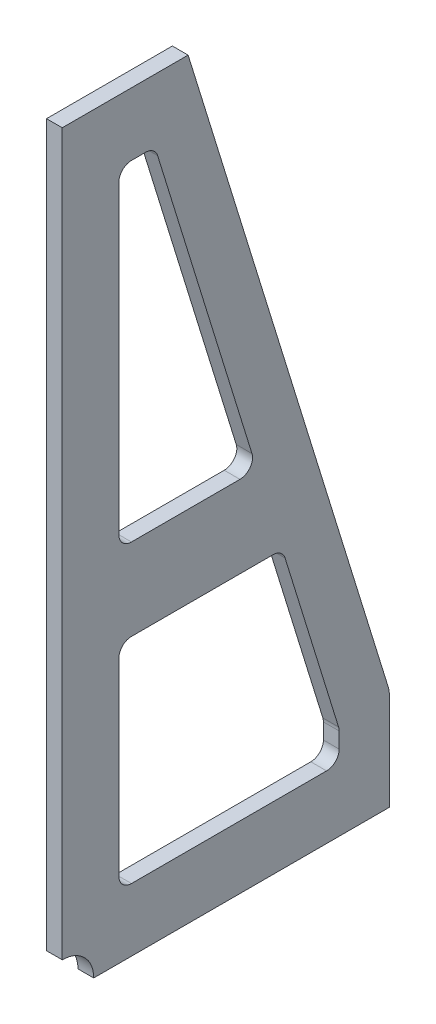
ISO-10303-21;
HEADER;
FILE_DESCRIPTION(('STEP AP214'),'2;1');
FILE_NAME('part.step','',(''),(''),'','','');
FILE_SCHEMA(('AUTOMOTIVE_DESIGN { 1 0 10303 214 1 1 1 1 }'));
ENDSEC;
DATA;
#1=APPLICATION_CONTEXT('core data for automotive mechanical design processes');
#2=APPLICATION_PROTOCOL_DEFINITION('international standard','automotive_design',2000,#1);
#3=PRODUCT_CONTEXT('',#1,'mechanical');
#4=PRODUCT('Part','Part','',(#3));
#5=PRODUCT_RELATED_PRODUCT_CATEGORY('part','',(#4));
#6=PRODUCT_DEFINITION_FORMATION('','',#4);
#7=PRODUCT_DEFINITION_CONTEXT('part definition',#1,'design');
#8=PRODUCT_DEFINITION('design','',#6,#7);
#9=PRODUCT_DEFINITION_SHAPE('','',#8);
#10=(LENGTH_UNIT() NAMED_UNIT(*) SI_UNIT(.MILLI.,.METRE.));
#11=(NAMED_UNIT(*) PLANE_ANGLE_UNIT() SI_UNIT($,.RADIAN.));
#12=(NAMED_UNIT(*) SI_UNIT($,.STERADIAN.) SOLID_ANGLE_UNIT());
#13=UNCERTAINTY_MEASURE_WITH_UNIT(LENGTH_MEASURE(1.E-05),#10,'distance_accuracy_value','');
#14=(GEOMETRIC_REPRESENTATION_CONTEXT(3) GLOBAL_UNCERTAINTY_ASSIGNED_CONTEXT((#13)) GLOBAL_UNIT_ASSIGNED_CONTEXT((#10,
#11,#12)) REPRESENTATION_CONTEXT('',''));
#15=CARTESIAN_POINT('',(0.,0.,0.));
#16=DIRECTION('',(0.,0.,1.));
#17=DIRECTION('',(1.,0.,0.));
#18=AXIS2_PLACEMENT_3D('',#15,#16,#17);
#19=CARTESIAN_POINT('',(-25.,0.,0.));
#20=DIRECTION('',(1.,0.,0.));
#21=DIRECTION('',(0.,0.,-1.));
#22=AXIS2_PLACEMENT_3D('',#19,#20,#21);
#23=CYLINDRICAL_SURFACE('',#22,50.);
#24=CARTESIAN_POINT('',(0.,0.,0.));
#25=DIRECTION('',(-1.,0.,0.));
#26=DIRECTION('',(0.,0.,-1.));
#27=AXIS2_PLACEMENT_3D('',#24,#25,#26);
#28=CIRCLE('',#27,50.);
#29=CARTESIAN_POINT('',(0.,50.,0.));
#30=VERTEX_POINT('',#29);
#31=CARTESIAN_POINT('',(0.,0.,-50.));
#32=VERTEX_POINT('',#31);
#33=EDGE_CURVE('E254',#30,#32,#28,.T.);
#34=ORIENTED_EDGE('',*,*,#33,.F.);
#35=DIRECTION('',(1.,0.,0.));
#36=VECTOR('',#35,1.);
#37=CARTESIAN_POINT('',(-25.,50.,0.));
#38=LINE('',#37,#36);
#39=CARTESIAN_POINT('',(-25.,50.,0.));
#40=VERTEX_POINT('',#39);
#41=EDGE_CURVE('E11',#40,#30,#38,.T.);
#42=ORIENTED_EDGE('',*,*,#41,.F.);
#43=CARTESIAN_POINT('',(-25.,0.,0.));
#44=DIRECTION('',(-1.,0.,0.));
#45=DIRECTION('',(0.,0.,-1.));
#46=AXIS2_PLACEMENT_3D('',#43,#44,#45);
#47=CIRCLE('',#46,50.);
#48=CARTESIAN_POINT('',(-25.,0.,-50.));
#49=VERTEX_POINT('',#48);
#50=EDGE_CURVE('E392',#40,#49,#47,.T.);
#51=ORIENTED_EDGE('',*,*,#50,.T.);
#52=DIRECTION('',(1.,0.,0.));
#53=VECTOR('',#52,1.);
#54=CARTESIAN_POINT('',(-25.,0.,-50.));
#55=LINE('',#54,#53);
#56=EDGE_CURVE('E45',#49,#32,#55,.T.);
#57=ORIENTED_EDGE('',*,*,#56,.T.);
#58=EDGE_LOOP('',(#34,#42,#51,#57));
#59=FACE_BOUND('',#58,.T.);
#60=ADVANCED_FACE('F42',(#59),#23,.F.);
#61=CARTESIAN_POINT('',(-25.,50.,0.));
#62=DIRECTION('',(0.,0.,1.));
#63=DIRECTION('',(1.,0.,0.));
#64=AXIS2_PLACEMENT_3D('',#61,#62,#63);
#65=PLANE('',#64);
#66=DIRECTION('',(0.,-1.,0.));
#67=VECTOR('',#66,1.);
#68=CARTESIAN_POINT('',(0.,50.,0.));
#69=LINE('',#68,#67);
#70=CARTESIAN_POINT('',(0.,1195.,0.));
#71=VERTEX_POINT('',#70);
#72=EDGE_CURVE('E397',#71,#30,#69,.T.);
#73=ORIENTED_EDGE('',*,*,#72,.F.);
#74=DIRECTION('',(1.,0.,0.));
#75=VECTOR('',#74,1.);
#76=CARTESIAN_POINT('',(-25.,1195.,0.));
#77=LINE('',#76,#75);
#78=CARTESIAN_POINT('',(-25.,1195.,0.));
#79=VERTEX_POINT('',#78);
#80=EDGE_CURVE('E51',#79,#71,#77,.T.);
#81=ORIENTED_EDGE('',*,*,#80,.F.);
#82=DIRECTION('',(0.,-1.,0.));
#83=VECTOR('',#82,1.);
#84=CARTESIAN_POINT('',(-25.,50.,0.));
#85=LINE('',#84,#83);
#86=EDGE_CURVE('E415',#79,#40,#85,.T.);
#87=ORIENTED_EDGE('',*,*,#86,.T.);
#88=ORIENTED_EDGE('',*,*,#41,.T.);
#89=EDGE_LOOP('',(#73,#81,#87,#88));
#90=FACE_BOUND('',#89,.T.);
#91=ADVANCED_FACE('F469',(#90),#65,.T.);
#92=CARTESIAN_POINT('',(-25.,1195.,0.));
#93=DIRECTION('',(0.,1.,0.));
#94=DIRECTION('',(0.,0.,1.));
#95=AXIS2_PLACEMENT_3D('',#92,#93,#94);
#96=PLANE('',#95);
#97=DIRECTION('',(0.,0.,1.));
#98=VECTOR('',#97,1.);
#99=CARTESIAN_POINT('',(0.,1195.,0.));
#100=LINE('',#99,#98);
#101=CARTESIAN_POINT('',(0.,1195.,-200.));
#102=VERTEX_POINT('',#101);
#103=EDGE_CURVE('E438',#102,#71,#100,.T.);
#104=ORIENTED_EDGE('',*,*,#103,.F.);
#105=DIRECTION('',(1.,0.,0.));
#106=VECTOR('',#105,1.);
#107=CARTESIAN_POINT('',(-25.,1195.,-200.));
#108=LINE('',#107,#106);
#109=CARTESIAN_POINT('',(-25.,1195.,-200.));
#110=VERTEX_POINT('',#109);
#111=EDGE_CURVE('E445',#110,#102,#108,.T.);
#112=ORIENTED_EDGE('',*,*,#111,.F.);
#113=DIRECTION('',(0.,0.,1.));
#114=VECTOR('',#113,1.);
#115=CARTESIAN_POINT('',(-25.,1195.,0.));
#116=LINE('',#115,#114);
#117=EDGE_CURVE('E412',#110,#79,#116,.T.);
#118=ORIENTED_EDGE('',*,*,#117,.T.);
#119=ORIENTED_EDGE('',*,*,#80,.T.);
#120=EDGE_LOOP('',(#104,#112,#118,#119));
#121=FACE_BOUND('',#120,.T.);
#122=ADVANCED_FACE('F485',(#121),#96,.T.);
#123=CARTESIAN_POINT('',(-25.,1195.,-200.));
#124=DIRECTION('',(0.,0.295382867562168,-0.955378962271386));
#125=DIRECTION('',(0.,0.955378962271386,0.295382867562168));
#126=AXIS2_PLACEMENT_3D('',#123,#124,#125);
#127=PLANE('',#126);
#128=DIRECTION('',(0.,0.955378962271386,0.295382867562168));
#129=VECTOR('',#128,1.);
#130=CARTESIAN_POINT('',(0.,1195.,-200.));
#131=LINE('',#130,#129);
#132=CARTESIAN_POINT('',(0.,167.216058445174,-517.768948113569));
#133=VERTEX_POINT('',#132);
#134=EDGE_CURVE('E434',#133,#102,#131,.T.);
#135=ORIENTED_EDGE('',*,*,#134,.F.);
#136=DIRECTION('',(1.,0.,0.));
#137=VECTOR('',#136,1.);
#138=CARTESIAN_POINT('',(-25.,167.216058445174,-517.768948113569));
#139=LINE('',#138,#137);
#140=CARTESIAN_POINT('',(-25.,167.216058445174,-517.768948113569));
#141=VERTEX_POINT('',#140);
#142=EDGE_CURVE('E447',#141,#133,#139,.T.);
#143=ORIENTED_EDGE('',*,*,#142,.F.);
#144=DIRECTION('',(0.,0.955378962271386,0.295382867562168));
#145=VECTOR('',#144,1.);
#146=CARTESIAN_POINT('',(-25.,1195.,-200.));
#147=LINE('',#146,#145);
#148=EDGE_CURVE('E408',#141,#110,#147,.T.);
#149=ORIENTED_EDGE('',*,*,#148,.T.);
#150=ORIENTED_EDGE('',*,*,#111,.T.);
#151=EDGE_LOOP('',(#135,#143,#149,#150));
#152=FACE_BOUND('',#151,.T.);
#153=ADVANCED_FACE('F483',(#152),#127,.T.);
#154=CARTESIAN_POINT('',(-25.,152.446915067066,-470.));
#155=DIRECTION('',(1.,0.,0.));
#156=DIRECTION('',(0.,0.,-1.));
#157=AXIS2_PLACEMENT_3D('',#154,#155,#156);
#158=CYLINDRICAL_SURFACE('',#157,50.);
#159=CARTESIAN_POINT('',(0.,152.446915067066,-470.));
#160=DIRECTION('',(1.,0.,0.));
#161=DIRECTION('',(0.,0.,1.));
#162=AXIS2_PLACEMENT_3D('',#159,#160,#161);
#163=CIRCLE('',#162,50.);
#164=CARTESIAN_POINT('',(0.,152.446915067066,-520.));
#165=VERTEX_POINT('',#164);
#166=EDGE_CURVE('E430',#165,#133,#163,.T.);
#167=ORIENTED_EDGE('',*,*,#166,.F.);
#168=DIRECTION('',(1.,0.,0.));
#169=VECTOR('',#168,1.);
#170=CARTESIAN_POINT('',(-25.,152.446915067066,-520.));
#171=LINE('',#170,#169);
#172=CARTESIAN_POINT('',(-25.,152.446915067066,-520.));
#173=VERTEX_POINT('',#172);
#174=EDGE_CURVE('E450',#173,#165,#171,.T.);
#175=ORIENTED_EDGE('',*,*,#174,.F.);
#176=CARTESIAN_POINT('',(-25.,152.446915067066,-470.));
#177=DIRECTION('',(1.,0.,0.));
#178=DIRECTION('',(0.,0.,1.));
#179=AXIS2_PLACEMENT_3D('',#176,#177,#178);
#180=CIRCLE('',#179,50.);
#181=EDGE_CURVE('E405',#173,#141,#180,.T.);
#182=ORIENTED_EDGE('',*,*,#181,.T.);
#183=ORIENTED_EDGE('',*,*,#142,.T.);
#184=EDGE_LOOP('',(#167,#175,#182,#183));
#185=FACE_BOUND('',#184,.T.);
#186=ADVANCED_FACE('F481',(#185),#158,.T.);
#187=CARTESIAN_POINT('',(-25.,152.446915067066,-520.));
#188=DIRECTION('',(0.,0.,-1.));
#189=DIRECTION('',(0.,1.,0.));
#190=AXIS2_PLACEMENT_3D('',#187,#188,#189);
#191=PLANE('',#190);
#192=DIRECTION('',(0.,1.,0.));
#193=VECTOR('',#192,1.);
#194=CARTESIAN_POINT('',(0.,152.446915067066,-520.));
#195=LINE('',#194,#193);
#196=CARTESIAN_POINT('',(0.,0.,-520.));
#197=VERTEX_POINT('',#196);
#198=EDGE_CURVE('E426',#197,#165,#195,.T.);
#199=ORIENTED_EDGE('',*,*,#198,.F.);
#200=DIRECTION('',(1.,0.,0.));
#201=VECTOR('',#200,1.);
#202=CARTESIAN_POINT('',(-25.,0.,-520.));
#203=LINE('',#202,#201);
#204=CARTESIAN_POINT('',(-25.,0.,-520.));
#205=VERTEX_POINT('',#204);
#206=EDGE_CURVE('E452',#205,#197,#203,.T.);
#207=ORIENTED_EDGE('',*,*,#206,.F.);
#208=DIRECTION('',(0.,1.,0.));
#209=VECTOR('',#208,1.);
#210=CARTESIAN_POINT('',(-25.,152.446915067066,-520.));
#211=LINE('',#210,#209);
#212=EDGE_CURVE('E401',#205,#173,#211,.T.);
#213=ORIENTED_EDGE('',*,*,#212,.T.);
#214=ORIENTED_EDGE('',*,*,#174,.T.);
#215=EDGE_LOOP('',(#199,#207,#213,#214));
#216=FACE_BOUND('',#215,.T.);
#217=ADVANCED_FACE('F477',(#216),#191,.T.);
#218=CARTESIAN_POINT('',(-25.,0.,-520.));
#219=DIRECTION('',(0.,-1.,0.));
#220=DIRECTION('',(0.,0.,-1.));
#221=AXIS2_PLACEMENT_3D('',#218,#219,#220);
#222=PLANE('',#221);
#223=DIRECTION('',(0.,0.,-1.));
#224=VECTOR('',#223,1.);
#225=CARTESIAN_POINT('',(0.,0.,-520.));
#226=LINE('',#225,#224);
#227=EDGE_CURVE('E422',#32,#197,#226,.T.);
#228=ORIENTED_EDGE('',*,*,#227,.F.);
#229=ORIENTED_EDGE('',*,*,#56,.F.);
#230=DIRECTION('',(0.,0.,-1.));
#231=VECTOR('',#230,1.);
#232=CARTESIAN_POINT('',(-25.,0.,-520.));
#233=LINE('',#232,#231);
#234=EDGE_CURVE('E396',#49,#205,#233,.T.);
#235=ORIENTED_EDGE('',*,*,#234,.T.);
#236=ORIENTED_EDGE('',*,*,#206,.T.);
#237=EDGE_LOOP('',(#228,#229,#235,#236));
#238=FACE_BOUND('',#237,.T.);
#239=ADVANCED_FACE('F463',(#238),#222,.T.);
#240=CARTESIAN_POINT('',(-25.,0.,0.));
#241=DIRECTION('',(1.,0.,0.));
#242=DIRECTION('',(0.,0.,-1.));
#243=AXIS2_PLACEMENT_3D('',#240,#241,#242);
#244=PLANE('',#243);
#245=DIRECTION('',(0.,-1.,0.));
#246=VECTOR('',#245,1.);
#247=CARTESIAN_POINT('',(-25.,144.893830134131,-440.));
#248=LINE('',#247,#246);
#249=CARTESIAN_POINT('',(-25.,144.893830134131,-440.));
#250=VERTEX_POINT('',#249);
#251=CARTESIAN_POINT('',(-25.,120.,-440.));
#252=VERTEX_POINT('',#251);
#253=EDGE_CURVE('E261',#250,#252,#248,.T.);
#254=ORIENTED_EDGE('',*,*,#253,.F.);
#255=CARTESIAN_POINT('',(-25.,144.893830134131,-420.));
#256=DIRECTION('',(1.,0.,0.));
#257=DIRECTION('',(0.,0.,-1.));
#258=AXIS2_PLACEMENT_3D('',#255,#256,#257);
#259=CIRCLE('',#258,20.);
#260=CARTESIAN_POINT('',(-25.,150.801487485375,-439.107579245428));
#261=VERTEX_POINT('',#260);
#262=EDGE_CURVE('E238',#261,#250,#259,.F.);
#263=ORIENTED_EDGE('',*,*,#262,.F.);
#264=DIRECTION('',(0.,-0.955378962271386,-0.295382867562168));
#265=VECTOR('',#264,1.);
#266=CARTESIAN_POINT('',(-25.,425.907657351243,-354.05059919028));
#267=LINE('',#266,#265);
#268=CARTESIAN_POINT('',(-25.,425.907657351243,-354.05059919028));
#269=VERTEX_POINT('',#268);
#270=EDGE_CURVE('E250',#269,#261,#267,.T.);
#271=ORIENTED_EDGE('',*,*,#270,.F.);
#272=CARTESIAN_POINT('',(-25.,420.,-334.943019944852));
#273=DIRECTION('',(1.,0.,0.));
#274=DIRECTION('',(0.,0.,-1.));
#275=AXIS2_PLACEMENT_3D('',#272,#273,#274);
#276=CIRCLE('',#275,20.);
#277=CARTESIAN_POINT('',(-25.,440.,-334.943019944852));
#278=VERTEX_POINT('',#277);
#279=EDGE_CURVE('E59',#278,#269,#276,.F.);
#280=ORIENTED_EDGE('',*,*,#279,.F.);
#281=DIRECTION('',(0.,0.,-1.));
#282=VECTOR('',#281,1.);
#283=CARTESIAN_POINT('',(-25.,440.,-110.));
#284=LINE('',#283,#282);
#285=CARTESIAN_POINT('',(-25.,440.,-110.));
#286=VERTEX_POINT('',#285);
#287=EDGE_CURVE('E715',#286,#278,#284,.T.);
#288=ORIENTED_EDGE('',*,*,#287,.F.);
#289=CARTESIAN_POINT('',(-25.,420.,-110.));
#290=DIRECTION('',(1.,0.,0.));
#291=DIRECTION('',(0.,0.,-1.));
#292=AXIS2_PLACEMENT_3D('',#289,#290,#291);
#293=CIRCLE('',#292,20.);
#294=CARTESIAN_POINT('',(-25.,420.,-90.));
#295=VERTEX_POINT('',#294);
#296=EDGE_CURVE('E719',#295,#286,#293,.F.);
#297=ORIENTED_EDGE('',*,*,#296,.F.);
#298=DIRECTION('',(0.,1.,0.));
#299=VECTOR('',#298,1.);
#300=CARTESIAN_POINT('',(-25.,120.,-90.));
#301=LINE('',#300,#299);
#302=CARTESIAN_POINT('',(-25.,120.,-90.));
#303=VERTEX_POINT('',#302);
#304=EDGE_CURVE('E726',#303,#295,#301,.T.);
#305=ORIENTED_EDGE('',*,*,#304,.F.);
#306=CARTESIAN_POINT('',(-25.,120.,-110.));
#307=DIRECTION('',(1.,0.,0.));
#308=DIRECTION('',(0.,0.,-1.));
#309=AXIS2_PLACEMENT_3D('',#306,#307,#308);
#310=CIRCLE('',#309,20.);
#311=CARTESIAN_POINT('',(-25.,99.9999999999999,-110.));
#312=VERTEX_POINT('',#311);
#313=EDGE_CURVE('E730',#312,#303,#310,.F.);
#314=ORIENTED_EDGE('',*,*,#313,.F.);
#315=DIRECTION('',(0.,0.,1.));
#316=VECTOR('',#315,1.);
#317=CARTESIAN_POINT('',(-25.,100.,-420.));
#318=LINE('',#317,#316);
#319=CARTESIAN_POINT('',(-25.,100.,-420.));
#320=VERTEX_POINT('',#319);
#321=EDGE_CURVE('E733',#320,#312,#318,.T.);
#322=ORIENTED_EDGE('',*,*,#321,.F.);
#323=CARTESIAN_POINT('',(-25.,120.,-420.));
#324=DIRECTION('',(1.,0.,0.));
#325=DIRECTION('',(0.,0.,-1.));
#326=AXIS2_PLACEMENT_3D('',#323,#324,#325);
#327=CIRCLE('',#326,20.);
#328=EDGE_CURVE('E268',#252,#320,#327,.F.);
#329=ORIENTED_EDGE('',*,*,#328,.F.);
#330=EDGE_LOOP('',(#254,#263,#271,#280,#288,#297,#305,#314,#322,#329));
#331=FACE_BOUND('',#330,.T.);
#332=DIRECTION('',(0.,0.,-1.));
#333=VECTOR('',#332,1.);
#334=CARTESIAN_POINT('',(-25.,1095.,-110.));
#335=LINE('',#334,#333);
#336=CARTESIAN_POINT('',(-25.,1095.,-110.));
#337=VERTEX_POINT('',#336);
#338=CARTESIAN_POINT('',(-25.,1095.,-132.430942650166));
#339=VERTEX_POINT('',#338);
#340=EDGE_CURVE('E341',#337,#339,#335,.T.);
#341=ORIENTED_EDGE('',*,*,#340,.F.);
#342=CARTESIAN_POINT('',(-25.,1075.,-110.));
#343=DIRECTION('',(1.,0.,0.));
#344=DIRECTION('',(0.,0.,-1.));
#345=AXIS2_PLACEMENT_3D('',#342,#343,#344);
#346=CIRCLE('',#345,20.);
#347=CARTESIAN_POINT('',(-25.,1075.,-90.));
#348=VERTEX_POINT('',#347);
#349=EDGE_CURVE('E344',#348,#337,#346,.F.);
#350=ORIENTED_EDGE('',*,*,#349,.F.);
#351=DIRECTION('',(0.,1.,0.));
#352=VECTOR('',#351,1.);
#353=CARTESIAN_POINT('',(-25.,590.,-90.));
#354=LINE('',#353,#352);
#355=CARTESIAN_POINT('',(-25.,590.,-90.));
#356=VERTEX_POINT('',#355);
#357=EDGE_CURVE('E374',#356,#348,#354,.T.);
#358=ORIENTED_EDGE('',*,*,#357,.F.);
#359=CARTESIAN_POINT('',(-25.,590.,-110.));
#360=DIRECTION('',(1.,0.,0.));
#361=DIRECTION('',(0.,0.,-1.));
#362=AXIS2_PLACEMENT_3D('',#359,#360,#361);
#363=CIRCLE('',#362,20.);
#364=CARTESIAN_POINT('',(-25.,570.,-110.));
#365=VERTEX_POINT('',#364);
#366=EDGE_CURVE('E67',#365,#356,#363,.F.);
#367=ORIENTED_EDGE('',*,*,#366,.F.);
#368=DIRECTION('',(0.,0.,1.));
#369=VECTOR('',#368,1.);
#370=CARTESIAN_POINT('',(-25.,570.,-282.382633471422));
#371=LINE('',#370,#369);
#372=CARTESIAN_POINT('',(-25.,570.,-282.382633471422));
#373=VERTEX_POINT('',#372);
#374=EDGE_CURVE('E328',#373,#365,#371,.T.);
#375=ORIENTED_EDGE('',*,*,#374,.F.);
#376=CARTESIAN_POINT('',(-25.,590.,-282.382633471422));
#377=DIRECTION('',(1.,0.,0.));
#378=DIRECTION('',(0.,0.,-1.));
#379=AXIS2_PLACEMENT_3D('',#376,#377,#378);
#380=CIRCLE('',#379,20.);
#381=CARTESIAN_POINT('',(-25.,595.907657351244,-301.49021271685));
#382=VERTEX_POINT('',#381);
#383=EDGE_CURVE('E331',#382,#373,#380,.F.);
#384=ORIENTED_EDGE('',*,*,#383,.F.);
#385=DIRECTION('',(0.,-0.955378962271386,-0.295382867562168));
#386=VECTOR('',#385,1.);
#387=CARTESIAN_POINT('',(-25.,1080.90765735124,-151.538521895594));
#388=LINE('',#387,#386);
#389=CARTESIAN_POINT('',(-25.,1080.90765735124,-151.538521895594));
#390=VERTEX_POINT('',#389);
#391=EDGE_CURVE('E334',#390,#382,#388,.T.);
#392=ORIENTED_EDGE('',*,*,#391,.F.);
#393=CARTESIAN_POINT('',(-25.,1075.,-132.430942650166));
#394=DIRECTION('',(1.,0.,0.));
#395=DIRECTION('',(0.,0.,-1.));
#396=AXIS2_PLACEMENT_3D('',#393,#394,#395);
#397=CIRCLE('',#396,20.);
#398=EDGE_CURVE('E338',#339,#390,#397,.F.);
#399=ORIENTED_EDGE('',*,*,#398,.F.);
#400=EDGE_LOOP('',(#341,#350,#358,#367,#375,#384,#392,#399));
#401=FACE_BOUND('',#400,.T.);
#402=ORIENTED_EDGE('',*,*,#50,.F.);
#403=ORIENTED_EDGE('',*,*,#86,.F.);
#404=ORIENTED_EDGE('',*,*,#117,.F.);
#405=ORIENTED_EDGE('',*,*,#148,.F.);
#406=ORIENTED_EDGE('',*,*,#181,.F.);
#407=ORIENTED_EDGE('',*,*,#212,.F.);
#408=ORIENTED_EDGE('',*,*,#234,.F.);
#409=EDGE_LOOP('',(#402,#403,#404,#405,#406,#407,#408));
#410=FACE_BOUND('',#409,.T.);
#411=ADVANCED_FACE('F257',(#331,#401,#410),#244,.F.);
#412=CARTESIAN_POINT('',(0.,0.,0.));
#413=DIRECTION('',(1.,0.,0.));
#414=DIRECTION('',(0.,0.,-1.));
#415=AXIS2_PLACEMENT_3D('',#412,#413,#414);
#416=PLANE('',#415);
#417=CARTESIAN_POINT('',(0.,144.893830134131,-420.));
#418=DIRECTION('',(1.,0.,0.));
#419=DIRECTION('',(0.,0.,1.));
#420=AXIS2_PLACEMENT_3D('',#417,#418,#419);
#421=CIRCLE('',#420,20.);
#422=CARTESIAN_POINT('',(0.,144.893830134131,-440.));
#423=VERTEX_POINT('',#422);
#424=CARTESIAN_POINT('',(0.,150.801487485375,-439.107579245428));
#425=VERTEX_POINT('',#424);
#426=EDGE_CURVE('E241',#423,#425,#421,.T.);
#427=ORIENTED_EDGE('',*,*,#426,.F.);
#428=DIRECTION('',(0.,1.,0.));
#429=VECTOR('',#428,1.);
#430=CARTESIAN_POINT('',(0.,144.893830134131,-440.));
#431=LINE('',#430,#429);
#432=CARTESIAN_POINT('',(0.,120.,-440.));
#433=VERTEX_POINT('',#432);
#434=EDGE_CURVE('E247',#433,#423,#431,.T.);
#435=ORIENTED_EDGE('',*,*,#434,.F.);
#436=CARTESIAN_POINT('',(0.,120.,-420.));
#437=DIRECTION('',(1.,0.,0.));
#438=DIRECTION('',(0.,0.,1.));
#439=AXIS2_PLACEMENT_3D('',#436,#437,#438);
#440=CIRCLE('',#439,20.);
#441=CARTESIAN_POINT('',(0.,100.,-420.));
#442=VERTEX_POINT('',#441);
#443=EDGE_CURVE('E297',#442,#433,#440,.T.);
#444=ORIENTED_EDGE('',*,*,#443,.F.);
#445=DIRECTION('',(0.,0.,-1.));
#446=VECTOR('',#445,1.);
#447=CARTESIAN_POINT('',(0.,100.,-420.));
#448=LINE('',#447,#446);
#449=CARTESIAN_POINT('',(0.,99.9999999999999,-110.));
#450=VERTEX_POINT('',#449);
#451=EDGE_CURVE('E293',#450,#442,#448,.T.);
#452=ORIENTED_EDGE('',*,*,#451,.F.);
#453=CARTESIAN_POINT('',(0.,120.,-110.));
#454=DIRECTION('',(1.,0.,0.));
#455=DIRECTION('',(0.,0.,-1.));
#456=AXIS2_PLACEMENT_3D('',#453,#454,#455);
#457=CIRCLE('',#456,20.);
#458=CARTESIAN_POINT('',(0.,120.,-90.));
#459=VERTEX_POINT('',#458);
#460=EDGE_CURVE('E289',#459,#450,#457,.T.);
#461=ORIENTED_EDGE('',*,*,#460,.F.);
#462=DIRECTION('',(0.,-1.,0.));
#463=VECTOR('',#462,1.);
#464=CARTESIAN_POINT('',(0.,120.,-90.));
#465=LINE('',#464,#463);
#466=CARTESIAN_POINT('',(0.,420.,-90.));
#467=VERTEX_POINT('',#466);
#468=EDGE_CURVE('E285',#467,#459,#465,.T.);
#469=ORIENTED_EDGE('',*,*,#468,.F.);
#470=CARTESIAN_POINT('',(0.,420.,-110.));
#471=DIRECTION('',(1.,0.,0.));
#472=DIRECTION('',(0.,0.,1.));
#473=AXIS2_PLACEMENT_3D('',#470,#471,#472);
#474=CIRCLE('',#473,20.);
#475=CARTESIAN_POINT('',(0.,440.,-110.));
#476=VERTEX_POINT('',#475);
#477=EDGE_CURVE('E281',#476,#467,#474,.T.);
#478=ORIENTED_EDGE('',*,*,#477,.F.);
#479=DIRECTION('',(0.,0.,1.));
#480=VECTOR('',#479,1.);
#481=CARTESIAN_POINT('',(0.,440.,-110.));
#482=LINE('',#481,#480);
#483=CARTESIAN_POINT('',(0.,440.,-334.943019944852));
#484=VERTEX_POINT('',#483);
#485=EDGE_CURVE('E277',#484,#476,#482,.T.);
#486=ORIENTED_EDGE('',*,*,#485,.F.);
#487=CARTESIAN_POINT('',(0.,420.,-334.943019944852));
#488=DIRECTION('',(1.,0.,0.));
#489=DIRECTION('',(0.,0.,1.));
#490=AXIS2_PLACEMENT_3D('',#487,#488,#489);
#491=CIRCLE('',#490,20.);
#492=CARTESIAN_POINT('',(0.,425.907657351243,-354.05059919028));
#493=VERTEX_POINT('',#492);
#494=EDGE_CURVE('E274',#493,#484,#491,.T.);
#495=ORIENTED_EDGE('',*,*,#494,.F.);
#496=DIRECTION('',(0.,0.955378962271386,0.295382867562168));
#497=VECTOR('',#496,1.);
#498=CARTESIAN_POINT('',(0.,425.907657351243,-354.05059919028));
#499=LINE('',#498,#497);
#500=EDGE_CURVE('E265',#425,#493,#499,.T.);
#501=ORIENTED_EDGE('',*,*,#500,.F.);
#502=EDGE_LOOP('',(#427,#435,#444,#452,#461,#469,#478,#486,#495,#501));
#503=FACE_BOUND('',#502,.T.);
#504=CARTESIAN_POINT('',(0.,1075.,-110.));
#505=DIRECTION('',(1.,0.,0.));
#506=DIRECTION('',(0.,0.,1.));
#507=AXIS2_PLACEMENT_3D('',#504,#505,#506);
#508=CIRCLE('',#507,20.);
#509=CARTESIAN_POINT('',(0.,1095.,-110.));
#510=VERTEX_POINT('',#509);
#511=CARTESIAN_POINT('',(0.,1075.,-90.));
#512=VERTEX_POINT('',#511);
#513=EDGE_CURVE('E347',#510,#512,#508,.T.);
#514=ORIENTED_EDGE('',*,*,#513,.F.);
#515=DIRECTION('',(0.,0.,1.));
#516=VECTOR('',#515,1.);
#517=CARTESIAN_POINT('',(0.,1095.,-110.));
#518=LINE('',#517,#516);
#519=CARTESIAN_POINT('',(0.,1095.,-132.430942650166));
#520=VERTEX_POINT('',#519);
#521=EDGE_CURVE('E368',#520,#510,#518,.T.);
#522=ORIENTED_EDGE('',*,*,#521,.F.);
#523=CARTESIAN_POINT('',(0.,1075.,-132.430942650166));
#524=DIRECTION('',(1.,0.,0.));
#525=DIRECTION('',(0.,0.,1.));
#526=AXIS2_PLACEMENT_3D('',#523,#524,#525);
#527=CIRCLE('',#526,20.);
#528=CARTESIAN_POINT('',(0.,1080.90765735124,-151.538521895594));
#529=VERTEX_POINT('',#528);
#530=EDGE_CURVE('E365',#529,#520,#527,.T.);
#531=ORIENTED_EDGE('',*,*,#530,.F.);
#532=DIRECTION('',(0.,0.955378962271386,0.295382867562168));
#533=VECTOR('',#532,1.);
#534=CARTESIAN_POINT('',(0.,1080.90765735124,-151.538521895594));
#535=LINE('',#534,#533);
#536=CARTESIAN_POINT('',(0.,595.907657351244,-301.49021271685));
#537=VERTEX_POINT('',#536);
#538=EDGE_CURVE('E361',#537,#529,#535,.T.);
#539=ORIENTED_EDGE('',*,*,#538,.F.);
#540=CARTESIAN_POINT('',(0.,590.,-282.382633471422));
#541=DIRECTION('',(1.,0.,0.));
#542=DIRECTION('',(0.,0.,1.));
#543=AXIS2_PLACEMENT_3D('',#540,#541,#542);
#544=CIRCLE('',#543,20.);
#545=CARTESIAN_POINT('',(0.,570.,-282.382633471422));
#546=VERTEX_POINT('',#545);
#547=EDGE_CURVE('E358',#546,#537,#544,.T.);
#548=ORIENTED_EDGE('',*,*,#547,.F.);
#549=DIRECTION('',(0.,0.,-1.));
#550=VECTOR('',#549,1.);
#551=CARTESIAN_POINT('',(0.,570.,-282.382633471422));
#552=LINE('',#551,#550);
#553=CARTESIAN_POINT('',(0.,570.,-110.));
#554=VERTEX_POINT('',#553);
#555=EDGE_CURVE('E355',#554,#546,#552,.T.);
#556=ORIENTED_EDGE('',*,*,#555,.F.);
#557=CARTESIAN_POINT('',(0.,590.,-110.));
#558=DIRECTION('',(1.,0.,0.));
#559=DIRECTION('',(0.,0.,-1.));
#560=AXIS2_PLACEMENT_3D('',#557,#558,#559);
#561=CIRCLE('',#560,20.);
#562=CARTESIAN_POINT('',(0.,590.,-90.));
#563=VERTEX_POINT('',#562);
#564=EDGE_CURVE('E352',#563,#554,#561,.T.);
#565=ORIENTED_EDGE('',*,*,#564,.F.);
#566=DIRECTION('',(0.,-1.,0.));
#567=VECTOR('',#566,1.);
#568=CARTESIAN_POINT('',(0.,590.,-90.));
#569=LINE('',#568,#567);
#570=EDGE_CURVE('E349',#512,#563,#569,.T.);
#571=ORIENTED_EDGE('',*,*,#570,.F.);
#572=EDGE_LOOP('',(#514,#522,#531,#539,#548,#556,#565,#571));
#573=FACE_BOUND('',#572,.T.);
#574=ORIENTED_EDGE('',*,*,#33,.T.);
#575=ORIENTED_EDGE('',*,*,#227,.T.);
#576=ORIENTED_EDGE('',*,*,#198,.T.);
#577=ORIENTED_EDGE('',*,*,#166,.T.);
#578=ORIENTED_EDGE('',*,*,#134,.T.);
#579=ORIENTED_EDGE('',*,*,#103,.T.);
#580=ORIENTED_EDGE('',*,*,#72,.T.);
#581=EDGE_LOOP('',(#574,#575,#576,#577,#578,#579,#580));
#582=FACE_BOUND('',#581,.T.);
#583=ADVANCED_FACE('F465',(#503,#573,#582),#416,.T.);
#584=CARTESIAN_POINT('',(-25.001,1075.,-110.));
#585=DIRECTION('',(1.,0.,0.));
#586=DIRECTION('',(0.,0.,-1.));
#587=AXIS2_PLACEMENT_3D('',#584,#585,#586);
#588=CYLINDRICAL_SURFACE('',#587,20.);
#589=ORIENTED_EDGE('',*,*,#349,.T.);
#590=DIRECTION('',(1.,0.,0.));
#591=VECTOR('',#590,1.);
#592=CARTESIAN_POINT('',(-25.001,1095.,-110.));
#593=LINE('',#592,#591);
#594=EDGE_CURVE('E372',#337,#510,#593,.T.);
#595=ORIENTED_EDGE('',*,*,#594,.T.);
#596=ORIENTED_EDGE('',*,*,#513,.T.);
#597=DIRECTION('',(1.,0.,0.));
#598=VECTOR('',#597,1.);
#599=CARTESIAN_POINT('',(-25.001,1075.,-90.));
#600=LINE('',#599,#598);
#601=EDGE_CURVE('E371',#348,#512,#600,.T.);
#602=ORIENTED_EDGE('',*,*,#601,.F.);
#603=EDGE_LOOP('',(#589,#595,#596,#602));
#604=FACE_BOUND('',#603,.T.);
#605=ADVANCED_FACE('F566',(#604),#588,.F.);
#606=CARTESIAN_POINT('',(-25.001,1095.,-110.));
#607=DIRECTION('',(0.,1.,0.));
#608=DIRECTION('',(0.,0.,1.));
#609=AXIS2_PLACEMENT_3D('',#606,#607,#608);
#610=PLANE('',#609);
#611=ORIENTED_EDGE('',*,*,#340,.T.);
#612=DIRECTION('',(1.,0.,0.));
#613=VECTOR('',#612,1.);
#614=CARTESIAN_POINT('',(-25.001,1095.,-132.430942650166));
#615=LINE('',#614,#613);
#616=EDGE_CURVE('E375',#339,#520,#615,.T.);
#617=ORIENTED_EDGE('',*,*,#616,.T.);
#618=ORIENTED_EDGE('',*,*,#521,.T.);
#619=ORIENTED_EDGE('',*,*,#594,.F.);
#620=EDGE_LOOP('',(#611,#617,#618,#619));
#621=FACE_BOUND('',#620,.T.);
#622=ADVANCED_FACE('F572',(#621),#610,.F.);
#623=CARTESIAN_POINT('',(-25.001,1075.,-132.430942650166));
#624=DIRECTION('',(1.,0.,0.));
#625=DIRECTION('',(0.,0.,-1.));
#626=AXIS2_PLACEMENT_3D('',#623,#624,#625);
#627=CYLINDRICAL_SURFACE('',#626,20.);
#628=ORIENTED_EDGE('',*,*,#398,.T.);
#629=DIRECTION('',(1.,0.,0.));
#630=VECTOR('',#629,1.);
#631=CARTESIAN_POINT('',(-25.001,1080.90765735124,-151.538521895594));
#632=LINE('',#631,#630);
#633=EDGE_CURVE('E377',#390,#529,#632,.T.);
#634=ORIENTED_EDGE('',*,*,#633,.T.);
#635=ORIENTED_EDGE('',*,*,#530,.T.);
#636=ORIENTED_EDGE('',*,*,#616,.F.);
#637=EDGE_LOOP('',(#628,#634,#635,#636));
#638=FACE_BOUND('',#637,.T.);
#639=ADVANCED_FACE('F580',(#638),#627,.F.);
#640=CARTESIAN_POINT('',(-25.001,1080.90765735124,-151.538521895594));
#641=DIRECTION('',(0.,0.295382867562168,-0.955378962271386));
#642=DIRECTION('',(0.,0.955378962271386,0.295382867562168));
#643=AXIS2_PLACEMENT_3D('',#640,#641,#642);
#644=PLANE('',#643);
#645=ORIENTED_EDGE('',*,*,#391,.T.);
#646=DIRECTION('',(1.,0.,0.));
#647=VECTOR('',#646,1.);
#648=CARTESIAN_POINT('',(-25.001,595.907657351244,-301.49021271685));
#649=LINE('',#648,#647);
#650=EDGE_CURVE('E379',#382,#537,#649,.T.);
#651=ORIENTED_EDGE('',*,*,#650,.T.);
#652=ORIENTED_EDGE('',*,*,#538,.T.);
#653=ORIENTED_EDGE('',*,*,#633,.F.);
#654=EDGE_LOOP('',(#645,#651,#652,#653));
#655=FACE_BOUND('',#654,.T.);
#656=ADVANCED_FACE('F588',(#655),#644,.F.);
#657=CARTESIAN_POINT('',(-25.001,590.,-282.382633471422));
#658=DIRECTION('',(1.,0.,0.));
#659=DIRECTION('',(0.,0.,-1.));
#660=AXIS2_PLACEMENT_3D('',#657,#658,#659);
#661=CYLINDRICAL_SURFACE('',#660,20.);
#662=ORIENTED_EDGE('',*,*,#383,.T.);
#663=DIRECTION('',(1.,0.,0.));
#664=VECTOR('',#663,1.);
#665=CARTESIAN_POINT('',(-25.001,570.,-282.382633471422));
#666=LINE('',#665,#664);
#667=EDGE_CURVE('E381',#373,#546,#666,.T.);
#668=ORIENTED_EDGE('',*,*,#667,.T.);
#669=ORIENTED_EDGE('',*,*,#547,.T.);
#670=ORIENTED_EDGE('',*,*,#650,.F.);
#671=EDGE_LOOP('',(#662,#668,#669,#670));
#672=FACE_BOUND('',#671,.T.);
#673=ADVANCED_FACE('F596',(#672),#661,.F.);
#674=CARTESIAN_POINT('',(-25.001,570.,-282.382633471422));
#675=DIRECTION('',(0.,-1.,0.));
#676=DIRECTION('',(0.,0.,-1.));
#677=AXIS2_PLACEMENT_3D('',#674,#675,#676);
#678=PLANE('',#677);
#679=ORIENTED_EDGE('',*,*,#374,.T.);
#680=DIRECTION('',(1.,0.,0.));
#681=VECTOR('',#680,1.);
#682=CARTESIAN_POINT('',(-25.001,570.,-110.));
#683=LINE('',#682,#681);
#684=EDGE_CURVE('E383',#365,#554,#683,.T.);
#685=ORIENTED_EDGE('',*,*,#684,.T.);
#686=ORIENTED_EDGE('',*,*,#555,.T.);
#687=ORIENTED_EDGE('',*,*,#667,.F.);
#688=EDGE_LOOP('',(#679,#685,#686,#687));
#689=FACE_BOUND('',#688,.T.);
#690=ADVANCED_FACE('F604',(#689),#678,.F.);
#691=CARTESIAN_POINT('',(-25.001,590.,-110.));
#692=DIRECTION('',(1.,0.,0.));
#693=DIRECTION('',(0.,0.,-1.));
#694=AXIS2_PLACEMENT_3D('',#691,#692,#693);
#695=CYLINDRICAL_SURFACE('',#694,20.);
#696=ORIENTED_EDGE('',*,*,#366,.T.);
#697=DIRECTION('',(1.,0.,0.));
#698=VECTOR('',#697,1.);
#699=CARTESIAN_POINT('',(-25.001,590.,-90.));
#700=LINE('',#699,#698);
#701=EDGE_CURVE('E385',#356,#563,#700,.T.);
#702=ORIENTED_EDGE('',*,*,#701,.T.);
#703=ORIENTED_EDGE('',*,*,#564,.T.);
#704=ORIENTED_EDGE('',*,*,#684,.F.);
#705=EDGE_LOOP('',(#696,#702,#703,#704));
#706=FACE_BOUND('',#705,.T.);
#707=ADVANCED_FACE('F612',(#706),#695,.F.);
#708=CARTESIAN_POINT('',(-25.001,590.,-90.));
#709=DIRECTION('',(0.,0.,1.));
#710=DIRECTION('',(1.,0.,0.));
#711=AXIS2_PLACEMENT_3D('',#708,#709,#710);
#712=PLANE('',#711);
#713=ORIENTED_EDGE('',*,*,#357,.T.);
#714=ORIENTED_EDGE('',*,*,#601,.T.);
#715=ORIENTED_EDGE('',*,*,#570,.T.);
#716=ORIENTED_EDGE('',*,*,#701,.F.);
#717=EDGE_LOOP('',(#713,#714,#715,#716));
#718=FACE_BOUND('',#717,.T.);
#719=ADVANCED_FACE('F620',(#718),#712,.F.);
#720=CARTESIAN_POINT('',(-25.001,144.893830134131,-420.));
#721=DIRECTION('',(1.,0.,0.));
#722=DIRECTION('',(0.,0.,-1.));
#723=AXIS2_PLACEMENT_3D('',#720,#721,#722);
#724=CYLINDRICAL_SURFACE('',#723,20.);
#725=ORIENTED_EDGE('',*,*,#262,.T.);
#726=DIRECTION('',(1.,0.,0.));
#727=VECTOR('',#726,1.);
#728=CARTESIAN_POINT('',(-25.001,144.893830134131,-440.));
#729=LINE('',#728,#727);
#730=EDGE_CURVE('E255',#250,#423,#729,.T.);
#731=ORIENTED_EDGE('',*,*,#730,.T.);
#732=ORIENTED_EDGE('',*,*,#426,.T.);
#733=DIRECTION('',(1.,0.,0.));
#734=VECTOR('',#733,1.);
#735=CARTESIAN_POINT('',(-25.001,150.801487485375,-439.107579245428));
#736=LINE('',#735,#734);
#737=EDGE_CURVE('E234',#261,#425,#736,.T.);
#738=ORIENTED_EDGE('',*,*,#737,.F.);
#739=EDGE_LOOP('',(#725,#731,#732,#738));
#740=FACE_BOUND('',#739,.T.);
#741=ADVANCED_FACE('F236',(#740),#724,.F.);
#742=CARTESIAN_POINT('',(-25.001,144.893830134131,-440.));
#743=DIRECTION('',(0.,0.,-1.));
#744=DIRECTION('',(-1.,0.,0.));
#745=AXIS2_PLACEMENT_3D('',#742,#743,#744);
#746=PLANE('',#745);
#747=ORIENTED_EDGE('',*,*,#253,.T.);
#748=DIRECTION('',(1.,0.,0.));
#749=VECTOR('',#748,1.);
#750=CARTESIAN_POINT('',(-25.001,120.,-440.));
#751=LINE('',#750,#749);
#752=EDGE_CURVE('E306',#252,#433,#751,.T.);
#753=ORIENTED_EDGE('',*,*,#752,.T.);
#754=ORIENTED_EDGE('',*,*,#434,.T.);
#755=ORIENTED_EDGE('',*,*,#730,.F.);
#756=EDGE_LOOP('',(#747,#753,#754,#755));
#757=FACE_BOUND('',#756,.T.);
#758=ADVANCED_FACE('F529',(#757),#746,.F.);
#759=CARTESIAN_POINT('',(-25.001,120.,-420.));
#760=DIRECTION('',(1.,0.,0.));
#761=DIRECTION('',(0.,0.,-1.));
#762=AXIS2_PLACEMENT_3D('',#759,#760,#761);
#763=CYLINDRICAL_SURFACE('',#762,20.);
#764=ORIENTED_EDGE('',*,*,#328,.T.);
#765=DIRECTION('',(1.,0.,0.));
#766=VECTOR('',#765,1.);
#767=CARTESIAN_POINT('',(-25.001,100.,-420.));
#768=LINE('',#767,#766);
#769=EDGE_CURVE('E309',#320,#442,#768,.T.);
#770=ORIENTED_EDGE('',*,*,#769,.T.);
#771=ORIENTED_EDGE('',*,*,#443,.T.);
#772=ORIENTED_EDGE('',*,*,#752,.F.);
#773=EDGE_LOOP('',(#764,#770,#771,#772));
#774=FACE_BOUND('',#773,.T.);
#775=ADVANCED_FACE('F524',(#774),#763,.F.);
#776=CARTESIAN_POINT('',(-25.001,100.,-420.));
#777=DIRECTION('',(0.,-1.,0.));
#778=DIRECTION('',(0.,0.,-1.));
#779=AXIS2_PLACEMENT_3D('',#776,#777,#778);
#780=PLANE('',#779);
#781=ORIENTED_EDGE('',*,*,#321,.T.);
#782=DIRECTION('',(1.,0.,0.));
#783=VECTOR('',#782,1.);
#784=CARTESIAN_POINT('',(-25.001,99.9999999999999,-110.));
#785=LINE('',#784,#783);
#786=EDGE_CURVE('E312',#312,#450,#785,.T.);
#787=ORIENTED_EDGE('',*,*,#786,.T.);
#788=ORIENTED_EDGE('',*,*,#451,.T.);
#789=ORIENTED_EDGE('',*,*,#769,.F.);
#790=EDGE_LOOP('',(#781,#787,#788,#789));
#791=FACE_BOUND('',#790,.T.);
#792=ADVANCED_FACE('F528',(#791),#780,.F.);
#793=CARTESIAN_POINT('',(-25.001,120.,-110.));
#794=DIRECTION('',(1.,0.,0.));
#795=DIRECTION('',(0.,0.,-1.));
#796=AXIS2_PLACEMENT_3D('',#793,#794,#795);
#797=CYLINDRICAL_SURFACE('',#796,20.);
#798=ORIENTED_EDGE('',*,*,#313,.T.);
#799=DIRECTION('',(1.,0.,0.));
#800=VECTOR('',#799,1.);
#801=CARTESIAN_POINT('',(-25.001,120.,-90.));
#802=LINE('',#801,#800);
#803=EDGE_CURVE('E315',#303,#459,#802,.T.);
#804=ORIENTED_EDGE('',*,*,#803,.T.);
#805=ORIENTED_EDGE('',*,*,#460,.T.);
#806=ORIENTED_EDGE('',*,*,#786,.F.);
#807=EDGE_LOOP('',(#798,#804,#805,#806));
#808=FACE_BOUND('',#807,.T.);
#809=ADVANCED_FACE('F514',(#808),#797,.F.);
#810=CARTESIAN_POINT('',(-25.001,120.,-90.));
#811=DIRECTION('',(0.,0.,1.));
#812=DIRECTION('',(0.,-1.,0.));
#813=AXIS2_PLACEMENT_3D('',#810,#811,#812);
#814=PLANE('',#813);
#815=ORIENTED_EDGE('',*,*,#304,.T.);
#816=DIRECTION('',(1.,0.,0.));
#817=VECTOR('',#816,1.);
#818=CARTESIAN_POINT('',(-25.001,420.,-90.));
#819=LINE('',#818,#817);
#820=EDGE_CURVE('E318',#295,#467,#819,.T.);
#821=ORIENTED_EDGE('',*,*,#820,.T.);
#822=ORIENTED_EDGE('',*,*,#468,.T.);
#823=ORIENTED_EDGE('',*,*,#803,.F.);
#824=EDGE_LOOP('',(#815,#821,#822,#823));
#825=FACE_BOUND('',#824,.T.);
#826=ADVANCED_FACE('F509',(#825),#814,.F.);
#827=CARTESIAN_POINT('',(-25.001,420.,-110.));
#828=DIRECTION('',(1.,0.,0.));
#829=DIRECTION('',(0.,0.,-1.));
#830=AXIS2_PLACEMENT_3D('',#827,#828,#829);
#831=CYLINDRICAL_SURFACE('',#830,20.);
#832=ORIENTED_EDGE('',*,*,#296,.T.);
#833=DIRECTION('',(1.,0.,0.));
#834=VECTOR('',#833,1.);
#835=CARTESIAN_POINT('',(-25.001,440.,-110.));
#836=LINE('',#835,#834);
#837=EDGE_CURVE('E321',#286,#476,#836,.T.);
#838=ORIENTED_EDGE('',*,*,#837,.T.);
#839=ORIENTED_EDGE('',*,*,#477,.T.);
#840=ORIENTED_EDGE('',*,*,#820,.F.);
#841=EDGE_LOOP('',(#832,#838,#839,#840));
#842=FACE_BOUND('',#841,.T.);
#843=ADVANCED_FACE('F513',(#842),#831,.F.);
#844=CARTESIAN_POINT('',(-25.001,440.,-110.));
#845=DIRECTION('',(0.,1.,0.));
#846=DIRECTION('',(0.,0.,1.));
#847=AXIS2_PLACEMENT_3D('',#844,#845,#846);
#848=PLANE('',#847);
#849=ORIENTED_EDGE('',*,*,#287,.T.);
#850=DIRECTION('',(1.,0.,0.));
#851=VECTOR('',#850,1.);
#852=CARTESIAN_POINT('',(-25.001,440.,-334.943019944852));
#853=LINE('',#852,#851);
#854=EDGE_CURVE('E324',#278,#484,#853,.T.);
#855=ORIENTED_EDGE('',*,*,#854,.T.);
#856=ORIENTED_EDGE('',*,*,#485,.T.);
#857=ORIENTED_EDGE('',*,*,#837,.F.);
#858=EDGE_LOOP('',(#849,#855,#856,#857));
#859=FACE_BOUND('',#858,.T.);
#860=ADVANCED_FACE('F675',(#859),#848,.F.);
#861=CARTESIAN_POINT('',(-25.001,420.,-334.943019944852));
#862=DIRECTION('',(1.,0.,0.));
#863=DIRECTION('',(0.,0.,-1.));
#864=AXIS2_PLACEMENT_3D('',#861,#862,#863);
#865=CYLINDRICAL_SURFACE('',#864,20.);
#866=ORIENTED_EDGE('',*,*,#279,.T.);
#867=DIRECTION('',(1.,0.,0.));
#868=VECTOR('',#867,1.);
#869=CARTESIAN_POINT('',(-25.001,425.907657351243,-354.05059919028));
#870=LINE('',#869,#868);
#871=EDGE_CURVE('E246',#269,#493,#870,.T.);
#872=ORIENTED_EDGE('',*,*,#871,.T.);
#873=ORIENTED_EDGE('',*,*,#494,.T.);
#874=ORIENTED_EDGE('',*,*,#854,.F.);
#875=EDGE_LOOP('',(#866,#872,#873,#874));
#876=FACE_BOUND('',#875,.T.);
#877=ADVANCED_FACE('F686',(#876),#865,.F.);
#878=CARTESIAN_POINT('',(-25.001,425.907657351243,-354.05059919028));
#879=DIRECTION('',(0.,0.295382867562168,-0.955378962271386));
#880=DIRECTION('',(0.,0.955378962271386,0.295382867562168));
#881=AXIS2_PLACEMENT_3D('',#878,#879,#880);
#882=PLANE('',#881);
#883=ORIENTED_EDGE('',*,*,#270,.T.);
#884=ORIENTED_EDGE('',*,*,#737,.T.);
#885=ORIENTED_EDGE('',*,*,#500,.T.);
#886=ORIENTED_EDGE('',*,*,#871,.F.);
#887=EDGE_LOOP('',(#883,#884,#885,#886));
#888=FACE_BOUND('',#887,.T.);
#889=ADVANCED_FACE('F251',(#888),#882,.F.);
#890=CLOSED_SHELL('',(#60,#91,#122,#153,#186,#217,#239,#411,#583,#605,#622,#639,#656,#673,#690,
#707,#719,#741,#758,#775,#792,#809,#826,#843,#860,#877,#889));
#891=MANIFOLD_SOLID_BREP('B2',#890);
#892=ADVANCED_BREP_SHAPE_REPRESENTATION('',(#18,#891),#14);
#893=SHAPE_DEFINITION_REPRESENTATION(#9,#892);
ENDSEC;
END-ISO-10303-21;
